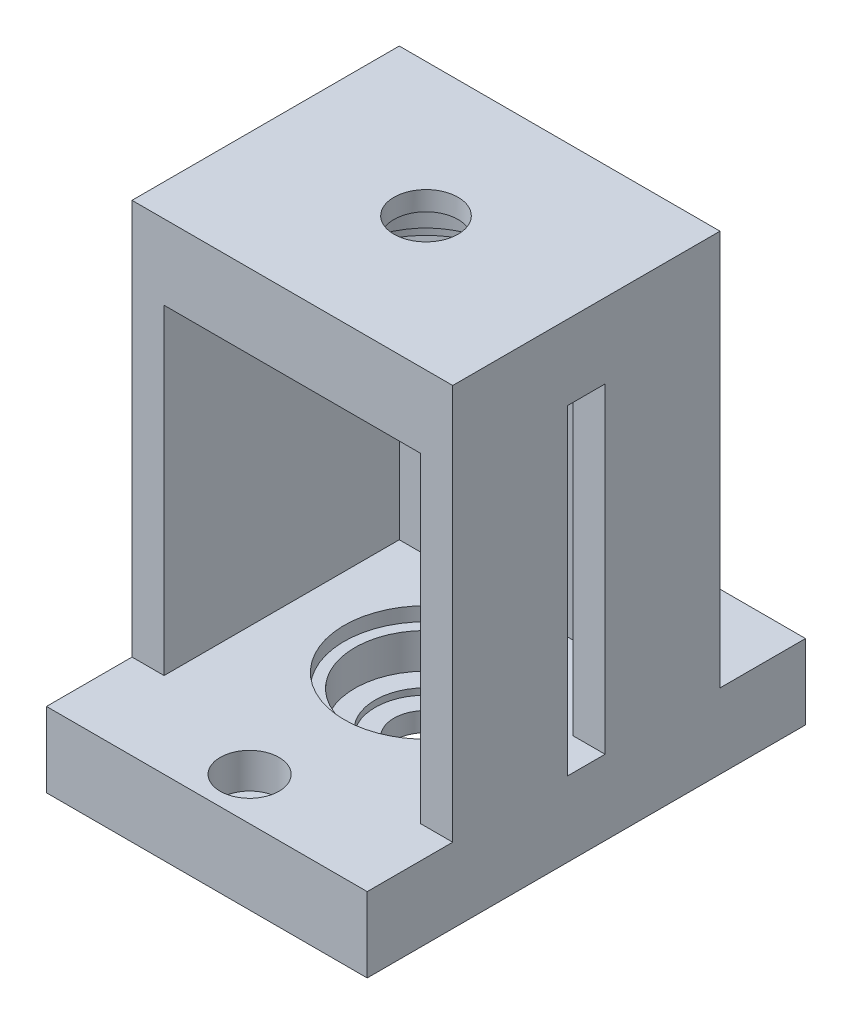
ISO-10303-21;
HEADER;
FILE_DESCRIPTION(('STEP AP214'),'2;1');
FILE_NAME('part.step','',(''),(''),'','','');
FILE_SCHEMA(('AUTOMOTIVE_DESIGN { 1 0 10303 214 1 1 1 1 }'));
ENDSEC;
DATA;
#1=APPLICATION_CONTEXT('core data for automotive mechanical design processes');
#2=APPLICATION_PROTOCOL_DEFINITION('international standard','automotive_design',2000,#1);
#3=PRODUCT_CONTEXT('',#1,'mechanical');
#4=PRODUCT('Part','Part','',(#3));
#5=PRODUCT_RELATED_PRODUCT_CATEGORY('part','',(#4));
#6=PRODUCT_DEFINITION_FORMATION('','',#4);
#7=PRODUCT_DEFINITION_CONTEXT('part definition',#1,'design');
#8=PRODUCT_DEFINITION('design','',#6,#7);
#9=PRODUCT_DEFINITION_SHAPE('','',#8);
#10=(LENGTH_UNIT() NAMED_UNIT(*) SI_UNIT(.MILLI.,.METRE.));
#11=(NAMED_UNIT(*) PLANE_ANGLE_UNIT() SI_UNIT($,.RADIAN.));
#12=(NAMED_UNIT(*) SI_UNIT($,.STERADIAN.) SOLID_ANGLE_UNIT());
#13=UNCERTAINTY_MEASURE_WITH_UNIT(LENGTH_MEASURE(1.E-05),#10,'distance_accuracy_value','');
#14=(GEOMETRIC_REPRESENTATION_CONTEXT(3) GLOBAL_UNCERTAINTY_ASSIGNED_CONTEXT((#13)) GLOBAL_UNIT_ASSIGNED_CONTEXT((#10,
#11,#12)) REPRESENTATION_CONTEXT('',''));
#15=CARTESIAN_POINT('',(0.,0.,0.));
#16=DIRECTION('',(0.,0.,1.));
#17=DIRECTION('',(1.,0.,0.));
#18=AXIS2_PLACEMENT_3D('',#15,#16,#17);
#19=CARTESIAN_POINT('',(0.,7.,16.5));
#20=DIRECTION('',(0.,-1.,0.));
#21=DIRECTION('',(0.,0.,-1.));
#22=AXIS2_PLACEMENT_3D('',#19,#20,#21);
#23=CYLINDRICAL_SURFACE('',#22,1.65);
#24=CARTESIAN_POINT('',(0.,0.,16.5));
#25=DIRECTION('',(0.,1.,0.));
#26=DIRECTION('',(0.,0.,1.));
#27=AXIS2_PLACEMENT_3D('',#24,#25,#26);
#28=CIRCLE('',#27,1.65);
#29=CARTESIAN_POINT('',(0.,0.,18.15));
#30=VERTEX_POINT('',#29);
#31=EDGE_CURVE('E201',#30,#30,#28,.T.);
#32=ORIENTED_EDGE('',*,*,#31,.F.);
#33=EDGE_LOOP('',(#32));
#34=FACE_BOUND('',#33,.T.);
#35=CARTESIAN_POINT('',(0.,3.7,16.5));
#36=DIRECTION('',(0.,1.,0.));
#37=DIRECTION('',(0.,0.,1.));
#38=AXIS2_PLACEMENT_3D('',#35,#36,#37);
#39=CIRCLE('',#38,1.65);
#40=CARTESIAN_POINT('',(0.,3.7,18.15));
#41=VERTEX_POINT('',#40);
#42=EDGE_CURVE('E49',#41,#41,#39,.T.);
#43=ORIENTED_EDGE('',*,*,#42,.T.);
#44=EDGE_LOOP('',(#43));
#45=FACE_BOUND('',#44,.T.);
#46=ADVANCED_FACE('F45',(#34,#45),#23,.F.);
#47=CARTESIAN_POINT('',(0.,7.,-16.5));
#48=DIRECTION('',(0.,-1.,0.));
#49=DIRECTION('',(0.,0.,-1.));
#50=AXIS2_PLACEMENT_3D('',#47,#48,#49);
#51=CYLINDRICAL_SURFACE('',#50,1.65);
#52=CARTESIAN_POINT('',(0.,0.,-16.5));
#53=DIRECTION('',(0.,1.,0.));
#54=DIRECTION('',(0.,0.,-1.));
#55=AXIS2_PLACEMENT_3D('',#52,#53,#54);
#56=CIRCLE('',#55,1.65);
#57=CARTESIAN_POINT('',(0.,0.,-18.15));
#58=VERTEX_POINT('',#57);
#59=EDGE_CURVE('E221',#58,#58,#56,.T.);
#60=ORIENTED_EDGE('',*,*,#59,.F.);
#61=EDGE_LOOP('',(#60));
#62=FACE_BOUND('',#61,.T.);
#63=CARTESIAN_POINT('',(0.,3.7,-16.5));
#64=DIRECTION('',(0.,1.,0.));
#65=DIRECTION('',(0.,0.,1.));
#66=AXIS2_PLACEMENT_3D('',#63,#64,#65);
#67=CIRCLE('',#66,1.65);
#68=CARTESIAN_POINT('',(0.,3.7,-14.85));
#69=VERTEX_POINT('',#68);
#70=EDGE_CURVE('E398',#69,#69,#67,.T.);
#71=ORIENTED_EDGE('',*,*,#70,.T.);
#72=EDGE_LOOP('',(#71));
#73=FACE_BOUND('',#72,.T.);
#74=ADVANCED_FACE('F432',(#62,#73),#51,.F.);
#75=CARTESIAN_POINT('',(-15.,7.,-12.5));
#76=DIRECTION('',(0.,0.,1.));
#77=DIRECTION('',(1.,0.,0.));
#78=AXIS2_PLACEMENT_3D('',#75,#76,#77);
#79=PLANE('',#78);
#80=DIRECTION('',(1.,0.,0.));
#81=VECTOR('',#80,1.);
#82=CARTESIAN_POINT('',(-15.,7.,-12.5));
#83=LINE('',#82,#81);
#84=CARTESIAN_POINT('',(-15.,7.,-12.5));
#85=VERTEX_POINT('',#84);
#86=CARTESIAN_POINT('',(15.,7.,-12.5));
#87=VERTEX_POINT('',#86);
#88=EDGE_CURVE('E64',#85,#87,#83,.T.);
#89=ORIENTED_EDGE('',*,*,#88,.F.);
#90=DIRECTION('',(0.,-1.,0.));
#91=VECTOR('',#90,1.);
#92=CARTESIAN_POINT('',(-15.,7.,-12.5));
#93=LINE('',#92,#91);
#94=CARTESIAN_POINT('',(-15.,44.,-12.5));
#95=VERTEX_POINT('',#94);
#96=EDGE_CURVE('E170',#95,#85,#93,.T.);
#97=ORIENTED_EDGE('',*,*,#96,.F.);
#98=DIRECTION('',(-1.,0.,0.));
#99=VECTOR('',#98,1.);
#100=CARTESIAN_POINT('',(15.,44.,-12.5));
#101=LINE('',#100,#99);
#102=CARTESIAN_POINT('',(15.,44.,-12.5));
#103=VERTEX_POINT('',#102);
#104=EDGE_CURVE('E330',#103,#95,#101,.T.);
#105=ORIENTED_EDGE('',*,*,#104,.F.);
#106=DIRECTION('',(0.,-1.,0.));
#107=VECTOR('',#106,1.);
#108=CARTESIAN_POINT('',(15.,7.,-12.5));
#109=LINE('',#108,#107);
#110=EDGE_CURVE('E55',#103,#87,#109,.T.);
#111=ORIENTED_EDGE('',*,*,#110,.T.);
#112=EDGE_LOOP('',(#89,#97,#105,#111));
#113=FACE_BOUND('',#112,.T.);
#114=ADVANCED_FACE('F495',(#113),#79,.F.);
#115=CARTESIAN_POINT('',(-15.,7.,12.5));
#116=DIRECTION('',(0.,0.,-1.));
#117=DIRECTION('',(-1.,0.,0.));
#118=AXIS2_PLACEMENT_3D('',#115,#116,#117);
#119=PLANE('',#118);
#120=DIRECTION('',(-1.,0.,0.));
#121=VECTOR('',#120,1.);
#122=CARTESIAN_POINT('',(-15.,7.,12.5));
#123=LINE('',#122,#121);
#124=CARTESIAN_POINT('',(15.,7.,12.5));
#125=VERTEX_POINT('',#124);
#126=CARTESIAN_POINT('',(12.,7.,12.5));
#127=VERTEX_POINT('',#126);
#128=EDGE_CURVE('E57',#125,#127,#123,.T.);
#129=ORIENTED_EDGE('',*,*,#128,.F.);
#130=DIRECTION('',(0.,-1.,0.));
#131=VECTOR('',#130,1.);
#132=CARTESIAN_POINT('',(15.,7.,12.5));
#133=LINE('',#132,#131);
#134=CARTESIAN_POINT('',(15.,44.,12.5));
#135=VERTEX_POINT('',#134);
#136=EDGE_CURVE('E171',#135,#125,#133,.T.);
#137=ORIENTED_EDGE('',*,*,#136,.F.);
#138=DIRECTION('',(1.,0.,0.));
#139=VECTOR('',#138,1.);
#140=CARTESIAN_POINT('',(-15.,44.,12.5));
#141=LINE('',#140,#139);
#142=CARTESIAN_POINT('',(-15.,44.,12.5));
#143=VERTEX_POINT('',#142);
#144=EDGE_CURVE('E164',#143,#135,#141,.T.);
#145=ORIENTED_EDGE('',*,*,#144,.F.);
#146=DIRECTION('',(0.,-1.,0.));
#147=VECTOR('',#146,1.);
#148=CARTESIAN_POINT('',(-15.,7.,12.5));
#149=LINE('',#148,#147);
#150=CARTESIAN_POINT('',(-15.,7.,12.5));
#151=VERTEX_POINT('',#150);
#152=EDGE_CURVE('E160',#143,#151,#149,.T.);
#153=ORIENTED_EDGE('',*,*,#152,.T.);
#154=CARTESIAN_POINT('',(-12.,7.,12.5));
#155=VERTEX_POINT('',#154);
#156=EDGE_CURVE('E11',#155,#151,#123,.T.);
#157=ORIENTED_EDGE('',*,*,#156,.F.);
#158=DIRECTION('',(0.,-1.,0.));
#159=VECTOR('',#158,1.);
#160=CARTESIAN_POINT('',(-12.,37.,12.5));
#161=LINE('',#160,#159);
#162=CARTESIAN_POINT('',(-12.,37.,12.5));
#163=VERTEX_POINT('',#162);
#164=EDGE_CURVE('E381',#163,#155,#161,.T.);
#165=ORIENTED_EDGE('',*,*,#164,.F.);
#166=DIRECTION('',(1.,0.,0.));
#167=VECTOR('',#166,1.);
#168=CARTESIAN_POINT('',(-15.,37.,12.5));
#169=LINE('',#168,#167);
#170=CARTESIAN_POINT('',(12.,37.,12.5));
#171=VERTEX_POINT('',#170);
#172=EDGE_CURVE('E326',#163,#171,#169,.T.);
#173=ORIENTED_EDGE('',*,*,#172,.T.);
#174=DIRECTION('',(0.,-1.,0.));
#175=VECTOR('',#174,1.);
#176=CARTESIAN_POINT('',(12.,37.,12.5));
#177=LINE('',#176,#175);
#178=EDGE_CURVE('E360',#171,#127,#177,.T.);
#179=ORIENTED_EDGE('',*,*,#178,.T.);
#180=EDGE_LOOP('',(#129,#137,#145,#153,#157,#165,#173,#179));
#181=FACE_BOUND('',#180,.T.);
#182=ADVANCED_FACE('F161',(#181),#119,.F.);
#183=CARTESIAN_POINT('',(15.,7.,12.5));
#184=DIRECTION('',(-1.,0.,0.));
#185=DIRECTION('',(0.,0.,1.));
#186=AXIS2_PLACEMENT_3D('',#183,#184,#185);
#187=PLANE('',#186);
#188=DIRECTION('',(0.,0.,-1.));
#189=VECTOR('',#188,1.);
#190=CARTESIAN_POINT('',(15.,0.,12.5));
#191=LINE('',#190,#189);
#192=CARTESIAN_POINT('',(15.,0.,20.5));
#193=VERTEX_POINT('',#192);
#194=CARTESIAN_POINT('',(15.,0.,-20.5));
#195=VERTEX_POINT('',#194);
#196=EDGE_CURVE('E384',#193,#195,#191,.T.);
#197=ORIENTED_EDGE('',*,*,#196,.T.);
#198=DIRECTION('',(0.,-1.,0.));
#199=VECTOR('',#198,1.);
#200=CARTESIAN_POINT('',(15.,7.,-20.5));
#201=LINE('',#200,#199);
#202=CARTESIAN_POINT('',(15.,7.,-20.5));
#203=VERTEX_POINT('',#202);
#204=EDGE_CURVE('E208',#203,#195,#201,.T.);
#205=ORIENTED_EDGE('',*,*,#204,.F.);
#206=DIRECTION('',(0.,0.,-1.));
#207=VECTOR('',#206,1.);
#208=CARTESIAN_POINT('',(15.,7.,-20.5));
#209=LINE('',#208,#207);
#210=EDGE_CURVE('E228',#87,#203,#209,.T.);
#211=ORIENTED_EDGE('',*,*,#210,.F.);
#212=ORIENTED_EDGE('',*,*,#110,.F.);
#213=DIRECTION('',(0.,0.,-1.));
#214=VECTOR('',#213,1.);
#215=CARTESIAN_POINT('',(15.,44.,12.5));
#216=LINE('',#215,#214);
#217=EDGE_CURVE('E339',#135,#103,#216,.T.);
#218=ORIENTED_EDGE('',*,*,#217,.F.);
#219=ORIENTED_EDGE('',*,*,#136,.T.);
#220=DIRECTION('',(0.,0.,-1.));
#221=VECTOR('',#220,1.);
#222=CARTESIAN_POINT('',(15.,7.,20.5));
#223=LINE('',#222,#221);
#224=CARTESIAN_POINT('',(15.,7.,20.5));
#225=VERTEX_POINT('',#224);
#226=EDGE_CURVE('E189',#225,#125,#223,.T.);
#227=ORIENTED_EDGE('',*,*,#226,.F.);
#228=DIRECTION('',(0.,-1.,0.));
#229=VECTOR('',#228,1.);
#230=CARTESIAN_POINT('',(15.,7.,20.5));
#231=LINE('',#230,#229);
#232=EDGE_CURVE('E197',#225,#193,#231,.T.);
#233=ORIENTED_EDGE('',*,*,#232,.T.);
#234=EDGE_LOOP('',(#197,#205,#211,#212,#218,#219,#227,#233));
#235=FACE_BOUND('',#234,.T.);
#236=DIRECTION('',(0.,1.,0.));
#237=VECTOR('',#236,1.);
#238=CARTESIAN_POINT('',(15.,7.,-1.75));
#239=LINE('',#238,#237);
#240=CARTESIAN_POINT('',(15.,7.,-1.75));
#241=VERTEX_POINT('',#240);
#242=CARTESIAN_POINT('',(15.,37.,-1.75));
#243=VERTEX_POINT('',#242);
#244=EDGE_CURVE('E265',#241,#243,#239,.T.);
#245=ORIENTED_EDGE('',*,*,#244,.F.);
#246=DIRECTION('',(0.,0.,-1.));
#247=VECTOR('',#246,1.);
#248=CARTESIAN_POINT('',(15.,7.,12.5));
#249=LINE('',#248,#247);
#250=CARTESIAN_POINT('',(15.,7.,1.75));
#251=VERTEX_POINT('',#250);
#252=EDGE_CURVE('E251',#251,#241,#249,.T.);
#253=ORIENTED_EDGE('',*,*,#252,.F.);
#254=DIRECTION('',(0.,-1.,0.));
#255=VECTOR('',#254,1.);
#256=CARTESIAN_POINT('',(15.,7.,1.75));
#257=LINE('',#256,#255);
#258=CARTESIAN_POINT('',(15.,37.,1.75));
#259=VERTEX_POINT('',#258);
#260=EDGE_CURVE('E257',#259,#251,#257,.T.);
#261=ORIENTED_EDGE('',*,*,#260,.F.);
#262=DIRECTION('',(0.,0.,1.));
#263=VECTOR('',#262,1.);
#264=CARTESIAN_POINT('',(15.,37.,12.5));
#265=LINE('',#264,#263);
#266=EDGE_CURVE('E248',#243,#259,#265,.T.);
#267=ORIENTED_EDGE('',*,*,#266,.F.);
#268=EDGE_LOOP('',(#245,#253,#261,#267));
#269=FACE_BOUND('',#268,.T.);
#270=ADVANCED_FACE('F47',(#235,#269),#187,.F.);
#271=CARTESIAN_POINT('',(12.,37.,-9.49999999999999));
#272=DIRECTION('',(1.,0.,0.));
#273=DIRECTION('',(0.,0.,-1.));
#274=AXIS2_PLACEMENT_3D('',#271,#272,#273);
#275=PLANE('',#274);
#276=DIRECTION('',(0.,-1.,0.));
#277=VECTOR('',#276,1.);
#278=CARTESIAN_POINT('',(12.,37.,-1.75));
#279=LINE('',#278,#277);
#280=CARTESIAN_POINT('',(12.,37.,-1.75));
#281=VERTEX_POINT('',#280);
#282=CARTESIAN_POINT('',(12.,7.,-1.75));
#283=VERTEX_POINT('',#282);
#284=EDGE_CURVE('E261',#281,#283,#279,.T.);
#285=ORIENTED_EDGE('',*,*,#284,.F.);
#286=DIRECTION('',(0.,0.,1.));
#287=VECTOR('',#286,1.);
#288=CARTESIAN_POINT('',(12.,37.,-9.49999999999999));
#289=LINE('',#288,#287);
#290=CARTESIAN_POINT('',(12.,37.,-9.49999999999999));
#291=VERTEX_POINT('',#290);
#292=EDGE_CURVE('E356',#291,#281,#289,.T.);
#293=ORIENTED_EDGE('',*,*,#292,.F.);
#294=DIRECTION('',(0.,-1.,0.));
#295=VECTOR('',#294,1.);
#296=CARTESIAN_POINT('',(12.,37.,-9.49999999999999));
#297=LINE('',#296,#295);
#298=CARTESIAN_POINT('',(12.,7.,-9.49999999999999));
#299=VERTEX_POINT('',#298);
#300=EDGE_CURVE('E373',#291,#299,#297,.T.);
#301=ORIENTED_EDGE('',*,*,#300,.T.);
#302=DIRECTION('',(0.,0.,1.));
#303=VECTOR('',#302,1.);
#304=CARTESIAN_POINT('',(12.,7.,-9.49999999999999));
#305=LINE('',#304,#303);
#306=EDGE_CURVE('E351',#299,#283,#305,.T.);
#307=ORIENTED_EDGE('',*,*,#306,.T.);
#308=EDGE_LOOP('',(#285,#293,#301,#307));
#309=FACE_BOUND('',#308,.T.);
#310=ADVANCED_FACE('F479',(#309),#275,.F.);
#311=DIRECTION('',(0.,1.,0.));
#312=VECTOR('',#311,1.);
#313=CARTESIAN_POINT('',(12.,37.,1.75));
#314=LINE('',#313,#312);
#315=CARTESIAN_POINT('',(12.,7.,1.75));
#316=VERTEX_POINT('',#315);
#317=CARTESIAN_POINT('',(12.,37.,1.75));
#318=VERTEX_POINT('',#317);
#319=EDGE_CURVE('E254',#316,#318,#314,.T.);
#320=ORIENTED_EDGE('',*,*,#319,.F.);
#321=EDGE_CURVE('E367',#316,#127,#305,.T.);
#322=ORIENTED_EDGE('',*,*,#321,.T.);
#323=ORIENTED_EDGE('',*,*,#178,.F.);
#324=EDGE_CURVE('E355',#318,#171,#289,.T.);
#325=ORIENTED_EDGE('',*,*,#324,.F.);
#326=EDGE_LOOP('',(#320,#322,#323,#325));
#327=FACE_BOUND('',#326,.T.);
#328=ADVANCED_FACE('F451',(#327),#275,.F.);
#329=CARTESIAN_POINT('',(0.,7.,0.));
#330=DIRECTION('',(0.,-1.,0.));
#331=DIRECTION('',(0.,0.,-1.));
#332=AXIS2_PLACEMENT_3D('',#329,#330,#331);
#333=PLANE('',#332);
#334=CARTESIAN_POINT('',(0.,7.,16.5));
#335=DIRECTION('',(0.,1.,0.));
#336=DIRECTION('',(0.,0.,1.));
#337=AXIS2_PLACEMENT_3D('',#334,#335,#336);
#338=CIRCLE('',#337,2.75);
#339=CARTESIAN_POINT('',(0.,7.,19.25));
#340=VERTEX_POINT('',#339);
#341=EDGE_CURVE('E414',#340,#340,#338,.T.);
#342=ORIENTED_EDGE('',*,*,#341,.F.);
#343=EDGE_LOOP('',(#342));
#344=FACE_BOUND('',#343,.T.);
#345=CARTESIAN_POINT('',(0.,7.,0.));
#346=DIRECTION('',(0.,1.,0.));
#347=DIRECTION('',(0.,0.,1.));
#348=AXIS2_PLACEMENT_3D('',#345,#346,#347);
#349=CIRCLE('',#348,7.65);
#350=CARTESIAN_POINT('',(0.,7.,7.65));
#351=VERTEX_POINT('',#350);
#352=EDGE_CURVE('E318',#351,#351,#349,.T.);
#353=ORIENTED_EDGE('',*,*,#352,.F.);
#354=EDGE_LOOP('',(#353));
#355=FACE_BOUND('',#354,.T.);
#356=DIRECTION('',(-1.,0.,0.));
#357=VECTOR('',#356,1.);
#358=CARTESIAN_POINT('',(15.000012,7.,-1.75));
#359=LINE('',#358,#357);
#360=EDGE_CURVE('E207',#241,#283,#359,.T.);
#361=ORIENTED_EDGE('',*,*,#360,.T.);
#362=ORIENTED_EDGE('',*,*,#306,.F.);
#363=DIRECTION('',(1.,0.,0.));
#364=VECTOR('',#363,1.);
#365=CARTESIAN_POINT('',(-12.,7.,-9.49999999999999));
#366=LINE('',#365,#364);
#367=CARTESIAN_POINT('',(-12.,7.,-9.49999999999999));
#368=VERTEX_POINT('',#367);
#369=EDGE_CURVE('E363',#368,#299,#366,.T.);
#370=ORIENTED_EDGE('',*,*,#369,.F.);
#371=DIRECTION('',(0.,0.,-1.));
#372=VECTOR('',#371,1.);
#373=CARTESIAN_POINT('',(-12.,7.,12.5));
#374=LINE('',#373,#372);
#375=EDGE_CURVE('E178',#155,#368,#374,.T.);
#376=ORIENTED_EDGE('',*,*,#375,.F.);
#377=ORIENTED_EDGE('',*,*,#156,.T.);
#378=DIRECTION('',(0.,0.,1.));
#379=VECTOR('',#378,1.);
#380=CARTESIAN_POINT('',(-15.,7.,12.5));
#381=LINE('',#380,#379);
#382=CARTESIAN_POINT('',(-15.,7.,20.5));
#383=VERTEX_POINT('',#382);
#384=EDGE_CURVE('E175',#151,#383,#381,.T.);
#385=ORIENTED_EDGE('',*,*,#384,.T.);
#386=DIRECTION('',(1.,0.,0.));
#387=VECTOR('',#386,1.);
#388=CARTESIAN_POINT('',(-15.,7.,20.5));
#389=LINE('',#388,#387);
#390=EDGE_CURVE('E185',#383,#225,#389,.T.);
#391=ORIENTED_EDGE('',*,*,#390,.T.);
#392=ORIENTED_EDGE('',*,*,#226,.T.);
#393=ORIENTED_EDGE('',*,*,#128,.T.);
#394=ORIENTED_EDGE('',*,*,#321,.F.);
#395=DIRECTION('',(-1.,0.,0.));
#396=VECTOR('',#395,1.);
#397=CARTESIAN_POINT('',(15.000012,7.,1.75));
#398=LINE('',#397,#396);
#399=EDGE_CURVE('E238',#251,#316,#398,.T.);
#400=ORIENTED_EDGE('',*,*,#399,.F.);
#401=ORIENTED_EDGE('',*,*,#252,.T.);
#402=EDGE_LOOP('',(#361,#362,#370,#376,#377,#385,#391,#392,#393,#394,#400,#401));
#403=FACE_BOUND('',#402,.T.);
#404=ADVANCED_FACE('F174',(#344,#355,#403),#333,.F.);
#405=CARTESIAN_POINT('',(-15.,7.,12.5));
#406=DIRECTION('',(1.,0.,0.));
#407=DIRECTION('',(0.,0.,-1.));
#408=AXIS2_PLACEMENT_3D('',#405,#406,#407);
#409=PLANE('',#408);
#410=DIRECTION('',(0.,0.,1.));
#411=VECTOR('',#410,1.);
#412=CARTESIAN_POINT('',(-15.,0.,12.5));
#413=LINE('',#412,#411);
#414=CARTESIAN_POINT('',(-15.,0.,-20.5));
#415=VERTEX_POINT('',#414);
#416=CARTESIAN_POINT('',(-15.,0.,20.5));
#417=VERTEX_POINT('',#416);
#418=EDGE_CURVE('E387',#415,#417,#413,.T.);
#419=ORIENTED_EDGE('',*,*,#418,.T.);
#420=DIRECTION('',(0.,-1.,0.));
#421=VECTOR('',#420,1.);
#422=CARTESIAN_POINT('',(-15.,7.,20.5));
#423=LINE('',#422,#421);
#424=EDGE_CURVE('E182',#383,#417,#423,.T.);
#425=ORIENTED_EDGE('',*,*,#424,.F.);
#426=ORIENTED_EDGE('',*,*,#384,.F.);
#427=ORIENTED_EDGE('',*,*,#152,.F.);
#428=DIRECTION('',(0.,0.,1.));
#429=VECTOR('',#428,1.);
#430=CARTESIAN_POINT('',(-15.,44.,-12.5));
#431=LINE('',#430,#429);
#432=EDGE_CURVE('E334',#95,#143,#431,.T.);
#433=ORIENTED_EDGE('',*,*,#432,.F.);
#434=ORIENTED_EDGE('',*,*,#96,.T.);
#435=DIRECTION('',(0.,0.,1.));
#436=VECTOR('',#435,1.);
#437=CARTESIAN_POINT('',(-15.,7.,-12.5));
#438=LINE('',#437,#436);
#439=CARTESIAN_POINT('',(-15.,7.,-20.5));
#440=VERTEX_POINT('',#439);
#441=EDGE_CURVE('E216',#440,#85,#438,.T.);
#442=ORIENTED_EDGE('',*,*,#441,.F.);
#443=DIRECTION('',(0.,-1.,0.));
#444=VECTOR('',#443,1.);
#445=CARTESIAN_POINT('',(-15.,7.,-20.5));
#446=LINE('',#445,#444);
#447=EDGE_CURVE('E212',#440,#415,#446,.T.);
#448=ORIENTED_EDGE('',*,*,#447,.T.);
#449=EDGE_LOOP('',(#419,#425,#426,#427,#433,#434,#442,#448));
#450=FACE_BOUND('',#449,.T.);
#451=ADVANCED_FACE('F180',(#450),#409,.F.);
#452=CARTESIAN_POINT('',(0.,0.,0.));
#453=DIRECTION('',(0.,-1.,0.));
#454=DIRECTION('',(0.,0.,-1.));
#455=AXIS2_PLACEMENT_3D('',#452,#453,#454);
#456=PLANE('',#455);
#457=CARTESIAN_POINT('',(0.,0.,0.));
#458=DIRECTION('',(0.,1.,0.));
#459=DIRECTION('',(0.,0.,1.));
#460=AXIS2_PLACEMENT_3D('',#457,#458,#459);
#461=CIRCLE('',#460,3.);
#462=CARTESIAN_POINT('',(0.,0.,3.));
#463=VERTEX_POINT('',#462);
#464=EDGE_CURVE('E272',#463,#463,#461,.T.);
#465=ORIENTED_EDGE('',*,*,#464,.T.);
#466=EDGE_LOOP('',(#465));
#467=FACE_BOUND('',#466,.T.);
#468=ORIENTED_EDGE('',*,*,#196,.F.);
#469=DIRECTION('',(1.,0.,0.));
#470=VECTOR('',#469,1.);
#471=CARTESIAN_POINT('',(-15.,0.,20.5));
#472=LINE('',#471,#470);
#473=EDGE_CURVE('E191',#417,#193,#472,.T.);
#474=ORIENTED_EDGE('',*,*,#473,.F.);
#475=ORIENTED_EDGE('',*,*,#418,.F.);
#476=DIRECTION('',(-1.,0.,0.));
#477=VECTOR('',#476,1.);
#478=CARTESIAN_POINT('',(-15.,0.,-20.5));
#479=LINE('',#478,#477);
#480=EDGE_CURVE('E217',#195,#415,#479,.T.);
#481=ORIENTED_EDGE('',*,*,#480,.F.);
#482=EDGE_LOOP('',(#468,#474,#475,#481));
#483=FACE_BOUND('',#482,.T.);
#484=ORIENTED_EDGE('',*,*,#31,.T.);
#485=EDGE_LOOP('',(#484));
#486=FACE_BOUND('',#485,.T.);
#487=ORIENTED_EDGE('',*,*,#59,.T.);
#488=EDGE_LOOP('',(#487));
#489=FACE_BOUND('',#488,.T.);
#490=ADVANCED_FACE('F427',(#467,#483,#486,#489),#456,.T.);
#491=CARTESIAN_POINT('',(-12.,37.,12.5));
#492=DIRECTION('',(-1.,0.,0.));
#493=DIRECTION('',(0.,0.,1.));
#494=AXIS2_PLACEMENT_3D('',#491,#492,#493);
#495=PLANE('',#494);
#496=ORIENTED_EDGE('',*,*,#375,.T.);
#497=DIRECTION('',(0.,-1.,0.));
#498=VECTOR('',#497,1.);
#499=CARTESIAN_POINT('',(-12.,37.,-9.49999999999999));
#500=LINE('',#499,#498);
#501=CARTESIAN_POINT('',(-12.,37.,-9.49999999999999));
#502=VERTEX_POINT('',#501);
#503=EDGE_CURVE('E377',#502,#368,#500,.T.);
#504=ORIENTED_EDGE('',*,*,#503,.F.);
#505=DIRECTION('',(0.,0.,-1.));
#506=VECTOR('',#505,1.);
#507=CARTESIAN_POINT('',(-12.,37.,12.5));
#508=LINE('',#507,#506);
#509=EDGE_CURVE('E346',#163,#502,#508,.T.);
#510=ORIENTED_EDGE('',*,*,#509,.F.);
#511=ORIENTED_EDGE('',*,*,#164,.T.);
#512=EDGE_LOOP('',(#496,#504,#510,#511));
#513=FACE_BOUND('',#512,.T.);
#514=ADVANCED_FACE('F485',(#513),#495,.F.);
#515=CARTESIAN_POINT('',(-12.,37.,-9.49999999999999));
#516=DIRECTION('',(0.,0.,-1.));
#517=DIRECTION('',(-1.,0.,0.));
#518=AXIS2_PLACEMENT_3D('',#515,#516,#517);
#519=PLANE('',#518);
#520=ORIENTED_EDGE('',*,*,#369,.T.);
#521=ORIENTED_EDGE('',*,*,#300,.F.);
#522=DIRECTION('',(1.,0.,0.));
#523=VECTOR('',#522,1.);
#524=CARTESIAN_POINT('',(-12.,37.,-9.49999999999999));
#525=LINE('',#524,#523);
#526=EDGE_CURVE('E350',#502,#291,#525,.T.);
#527=ORIENTED_EDGE('',*,*,#526,.F.);
#528=ORIENTED_EDGE('',*,*,#503,.T.);
#529=EDGE_LOOP('',(#520,#521,#527,#528));
#530=FACE_BOUND('',#529,.T.);
#531=ADVANCED_FACE('F477',(#530),#519,.F.);
#532=CARTESIAN_POINT('',(0.,37.,0.));
#533=DIRECTION('',(0.,1.,0.));
#534=DIRECTION('',(0.,0.,1.));
#535=AXIS2_PLACEMENT_3D('',#532,#533,#534);
#536=PLANE('',#535);
#537=ORIENTED_EDGE('',*,*,#292,.T.);
#538=DIRECTION('',(-1.,0.,0.));
#539=VECTOR('',#538,1.);
#540=CARTESIAN_POINT('',(15.000012,37.,-1.75));
#541=LINE('',#540,#539);
#542=EDGE_CURVE('E245',#243,#281,#541,.T.);
#543=ORIENTED_EDGE('',*,*,#542,.F.);
#544=ORIENTED_EDGE('',*,*,#266,.T.);
#545=DIRECTION('',(-1.,0.,0.));
#546=VECTOR('',#545,1.);
#547=CARTESIAN_POINT('',(15.000012,37.,1.75));
#548=LINE('',#547,#546);
#549=EDGE_CURVE('E241',#259,#318,#548,.T.);
#550=ORIENTED_EDGE('',*,*,#549,.T.);
#551=ORIENTED_EDGE('',*,*,#324,.T.);
#552=ORIENTED_EDGE('',*,*,#172,.F.);
#553=ORIENTED_EDGE('',*,*,#509,.T.);
#554=ORIENTED_EDGE('',*,*,#526,.T.);
#555=EDGE_LOOP('',(#537,#543,#544,#550,#551,#552,#553,#554));
#556=FACE_BOUND('',#555,.T.);
#557=CARTESIAN_POINT('',(0.,37.,0.));
#558=DIRECTION('',(0.,-1.,0.));
#559=DIRECTION('',(0.,0.,-1.));
#560=AXIS2_PLACEMENT_3D('',#557,#558,#559);
#561=CIRCLE('',#560,7.65);
#562=CARTESIAN_POINT('',(0.,37.,-7.65));
#563=VERTEX_POINT('',#562);
#564=EDGE_CURVE('E310',#563,#563,#561,.T.);
#565=ORIENTED_EDGE('',*,*,#564,.F.);
#566=EDGE_LOOP('',(#565));
#567=FACE_BOUND('',#566,.T.);
#568=ADVANCED_FACE('F470',(#556,#567),#536,.F.);
#569=CARTESIAN_POINT('',(0.,44.,0.));
#570=DIRECTION('',(0.,1.,0.));
#571=DIRECTION('',(0.,0.,1.));
#572=AXIS2_PLACEMENT_3D('',#569,#570,#571);
#573=PLANE('',#572);
#574=CARTESIAN_POINT('',(0.,44.,0.));
#575=DIRECTION('',(0.,1.,0.));
#576=DIRECTION('',(0.,0.,1.));
#577=AXIS2_PLACEMENT_3D('',#574,#575,#576);
#578=CIRCLE('',#577,3.);
#579=CARTESIAN_POINT('',(0.,44.,3.));
#580=VERTEX_POINT('',#579);
#581=EDGE_CURVE('E268',#580,#580,#578,.T.);
#582=ORIENTED_EDGE('',*,*,#581,.F.);
#583=EDGE_LOOP('',(#582));
#584=FACE_BOUND('',#583,.T.);
#585=ORIENTED_EDGE('',*,*,#104,.T.);
#586=ORIENTED_EDGE('',*,*,#432,.T.);
#587=ORIENTED_EDGE('',*,*,#144,.T.);
#588=ORIENTED_EDGE('',*,*,#217,.T.);
#589=EDGE_LOOP('',(#585,#586,#587,#588));
#590=FACE_BOUND('',#589,.T.);
#591=ADVANCED_FACE('F458',(#584,#590),#573,.T.);
#592=CARTESIAN_POINT('',(0.,5.7,0.));
#593=DIRECTION('',(0.,1.,0.));
#594=DIRECTION('',(0.,0.,1.));
#595=AXIS2_PLACEMENT_3D('',#592,#593,#594);
#596=CYLINDRICAL_SURFACE('',#595,7.65);
#597=CARTESIAN_POINT('',(0.,5.7,0.));
#598=DIRECTION('',(0.,1.,0.));
#599=DIRECTION('',(0.,0.,1.));
#600=AXIS2_PLACEMENT_3D('',#597,#598,#599);
#601=CIRCLE('',#600,7.65);
#602=CARTESIAN_POINT('',(0.,5.7,7.65));
#603=VERTEX_POINT('',#602);
#604=EDGE_CURVE('E322',#603,#603,#601,.T.);
#605=ORIENTED_EDGE('',*,*,#604,.F.);
#606=EDGE_LOOP('',(#605));
#607=FACE_BOUND('',#606,.T.);
#608=ORIENTED_EDGE('',*,*,#352,.T.);
#609=EDGE_LOOP('',(#608));
#610=FACE_BOUND('',#609,.T.);
#611=ADVANCED_FACE('F455',(#607,#610),#596,.F.);
#612=CARTESIAN_POINT('',(0.,5.7,0.));
#613=DIRECTION('',(0.,1.,0.));
#614=DIRECTION('',(0.,0.,1.));
#615=AXIS2_PLACEMENT_3D('',#612,#613,#614);
#616=PLANE('',#615);
#617=CARTESIAN_POINT('',(0.,5.7,0.));
#618=DIRECTION('',(0.,1.,0.));
#619=DIRECTION('',(0.,0.,1.));
#620=AXIS2_PLACEMENT_3D('',#617,#618,#619);
#621=CIRCLE('',#620,6.65);
#622=CARTESIAN_POINT('',(0.,5.7,6.65));
#623=VERTEX_POINT('',#622);
#624=EDGE_CURVE('E302',#623,#623,#621,.T.);
#625=ORIENTED_EDGE('',*,*,#624,.F.);
#626=EDGE_LOOP('',(#625));
#627=FACE_BOUND('',#626,.T.);
#628=ORIENTED_EDGE('',*,*,#604,.T.);
#629=EDGE_LOOP('',(#628));
#630=FACE_BOUND('',#629,.T.);
#631=ADVANCED_FACE('F457',(#627,#630),#616,.T.);
#632=CARTESIAN_POINT('',(0.,38.3,0.));
#633=DIRECTION('',(0.,-1.,0.));
#634=DIRECTION('',(0.,0.,-1.));
#635=AXIS2_PLACEMENT_3D('',#632,#633,#634);
#636=CYLINDRICAL_SURFACE('',#635,7.65);
#637=CARTESIAN_POINT('',(0.,38.3,0.));
#638=DIRECTION('',(0.,-1.,0.));
#639=DIRECTION('',(0.,0.,-1.));
#640=AXIS2_PLACEMENT_3D('',#637,#638,#639);
#641=CIRCLE('',#640,7.65);
#642=CARTESIAN_POINT('',(0.,38.3,-7.65));
#643=VERTEX_POINT('',#642);
#644=EDGE_CURVE('E314',#643,#643,#641,.T.);
#645=ORIENTED_EDGE('',*,*,#644,.F.);
#646=EDGE_LOOP('',(#645));
#647=FACE_BOUND('',#646,.T.);
#648=ORIENTED_EDGE('',*,*,#564,.T.);
#649=EDGE_LOOP('',(#648));
#650=FACE_BOUND('',#649,.T.);
#651=ADVANCED_FACE('F466',(#647,#650),#636,.F.);
#652=CARTESIAN_POINT('',(0.,38.3,0.));
#653=DIRECTION('',(0.,-1.,0.));
#654=DIRECTION('',(0.,0.,-1.));
#655=AXIS2_PLACEMENT_3D('',#652,#653,#654);
#656=PLANE('',#655);
#657=CARTESIAN_POINT('',(0.,38.3,0.));
#658=DIRECTION('',(0.,-1.,0.));
#659=DIRECTION('',(0.,0.,-1.));
#660=AXIS2_PLACEMENT_3D('',#657,#658,#659);
#661=CIRCLE('',#660,6.65);
#662=CARTESIAN_POINT('',(0.,38.3,-6.65));
#663=VERTEX_POINT('',#662);
#664=EDGE_CURVE('E294',#663,#663,#661,.T.);
#665=ORIENTED_EDGE('',*,*,#664,.F.);
#666=EDGE_LOOP('',(#665));
#667=FACE_BOUND('',#666,.T.);
#668=ORIENTED_EDGE('',*,*,#644,.T.);
#669=EDGE_LOOP('',(#668));
#670=FACE_BOUND('',#669,.T.);
#671=ADVANCED_FACE('F555',(#667,#670),#656,.T.);
#672=CARTESIAN_POINT('',(0.,2.4,0.));
#673=DIRECTION('',(0.,1.,0.));
#674=DIRECTION('',(0.,0.,1.));
#675=AXIS2_PLACEMENT_3D('',#672,#673,#674);
#676=CYLINDRICAL_SURFACE('',#675,6.65);
#677=CARTESIAN_POINT('',(0.,2.4,0.));
#678=DIRECTION('',(0.,1.,0.));
#679=DIRECTION('',(0.,0.,1.));
#680=AXIS2_PLACEMENT_3D('',#677,#678,#679);
#681=CIRCLE('',#680,6.65);
#682=CARTESIAN_POINT('',(0.,2.4,6.65));
#683=VERTEX_POINT('',#682);
#684=EDGE_CURVE('E306',#683,#683,#681,.T.);
#685=ORIENTED_EDGE('',*,*,#684,.F.);
#686=EDGE_LOOP('',(#685));
#687=FACE_BOUND('',#686,.T.);
#688=ORIENTED_EDGE('',*,*,#624,.T.);
#689=EDGE_LOOP('',(#688));
#690=FACE_BOUND('',#689,.T.);
#691=ADVANCED_FACE('F551',(#687,#690),#676,.F.);
#692=CARTESIAN_POINT('',(0.,2.4,0.));
#693=DIRECTION('',(0.,1.,0.));
#694=DIRECTION('',(0.,0.,1.));
#695=AXIS2_PLACEMENT_3D('',#692,#693,#694);
#696=PLANE('',#695);
#697=CARTESIAN_POINT('',(0.,2.4,0.));
#698=DIRECTION('',(0.,1.,0.));
#699=DIRECTION('',(0.,0.,1.));
#700=AXIS2_PLACEMENT_3D('',#697,#698,#699);
#701=CIRCLE('',#700,4.75);
#702=CARTESIAN_POINT('',(0.,2.4,4.75));
#703=VERTEX_POINT('',#702);
#704=EDGE_CURVE('E286',#703,#703,#701,.T.);
#705=ORIENTED_EDGE('',*,*,#704,.F.);
#706=EDGE_LOOP('',(#705));
#707=FACE_BOUND('',#706,.T.);
#708=ORIENTED_EDGE('',*,*,#684,.T.);
#709=EDGE_LOOP('',(#708));
#710=FACE_BOUND('',#709,.T.);
#711=ADVANCED_FACE('F547',(#707,#710),#696,.T.);
#712=CARTESIAN_POINT('',(0.,41.6,0.));
#713=DIRECTION('',(0.,-1.,0.));
#714=DIRECTION('',(0.,0.,-1.));
#715=AXIS2_PLACEMENT_3D('',#712,#713,#714);
#716=CYLINDRICAL_SURFACE('',#715,6.65);
#717=CARTESIAN_POINT('',(0.,41.6,0.));
#718=DIRECTION('',(0.,-1.,0.));
#719=DIRECTION('',(0.,0.,-1.));
#720=AXIS2_PLACEMENT_3D('',#717,#718,#719);
#721=CIRCLE('',#720,6.65);
#722=CARTESIAN_POINT('',(0.,41.6,-6.65));
#723=VERTEX_POINT('',#722);
#724=EDGE_CURVE('E298',#723,#723,#721,.T.);
#725=ORIENTED_EDGE('',*,*,#724,.F.);
#726=EDGE_LOOP('',(#725));
#727=FACE_BOUND('',#726,.T.);
#728=ORIENTED_EDGE('',*,*,#664,.T.);
#729=EDGE_LOOP('',(#728));
#730=FACE_BOUND('',#729,.T.);
#731=ADVANCED_FACE('F543',(#727,#730),#716,.F.);
#732=CARTESIAN_POINT('',(0.,41.6,0.));
#733=DIRECTION('',(0.,-1.,0.));
#734=DIRECTION('',(0.,0.,-1.));
#735=AXIS2_PLACEMENT_3D('',#732,#733,#734);
#736=PLANE('',#735);
#737=CARTESIAN_POINT('',(0.,41.6,0.));
#738=DIRECTION('',(0.,-1.,0.));
#739=DIRECTION('',(0.,0.,-1.));
#740=AXIS2_PLACEMENT_3D('',#737,#738,#739);
#741=CIRCLE('',#740,4.75);
#742=CARTESIAN_POINT('',(0.,41.6,-4.75));
#743=VERTEX_POINT('',#742);
#744=EDGE_CURVE('E281',#743,#743,#741,.T.);
#745=ORIENTED_EDGE('',*,*,#744,.F.);
#746=EDGE_LOOP('',(#745));
#747=FACE_BOUND('',#746,.T.);
#748=ORIENTED_EDGE('',*,*,#724,.T.);
#749=EDGE_LOOP('',(#748));
#750=FACE_BOUND('',#749,.T.);
#751=ADVANCED_FACE('F539',(#747,#750),#736,.T.);
#752=CARTESIAN_POINT('',(0.,1.8,0.));
#753=DIRECTION('',(0.,1.,0.));
#754=DIRECTION('',(0.,0.,1.));
#755=AXIS2_PLACEMENT_3D('',#752,#753,#754);
#756=CYLINDRICAL_SURFACE('',#755,4.75);
#757=CARTESIAN_POINT('',(0.,1.8,0.));
#758=DIRECTION('',(0.,1.,0.));
#759=DIRECTION('',(0.,0.,1.));
#760=AXIS2_PLACEMENT_3D('',#757,#758,#759);
#761=CIRCLE('',#760,4.75);
#762=CARTESIAN_POINT('',(0.,1.8,4.75));
#763=VERTEX_POINT('',#762);
#764=EDGE_CURVE('E290',#763,#763,#761,.T.);
#765=ORIENTED_EDGE('',*,*,#764,.F.);
#766=EDGE_LOOP('',(#765));
#767=FACE_BOUND('',#766,.T.);
#768=ORIENTED_EDGE('',*,*,#704,.T.);
#769=EDGE_LOOP('',(#768));
#770=FACE_BOUND('',#769,.T.);
#771=ADVANCED_FACE('F535',(#767,#770),#756,.F.);
#772=CARTESIAN_POINT('',(0.,1.8,0.));
#773=DIRECTION('',(0.,1.,0.));
#774=DIRECTION('',(0.,0.,1.));
#775=AXIS2_PLACEMENT_3D('',#772,#773,#774);
#776=PLANE('',#775);
#777=CARTESIAN_POINT('',(0.,1.8,0.));
#778=DIRECTION('',(0.,1.,0.));
#779=DIRECTION('',(0.,0.,1.));
#780=AXIS2_PLACEMENT_3D('',#777,#778,#779);
#781=CIRCLE('',#780,3.);
#782=CARTESIAN_POINT('',(0.,1.8,3.));
#783=VERTEX_POINT('',#782);
#784=EDGE_CURVE('E277',#783,#783,#781,.T.);
#785=ORIENTED_EDGE('',*,*,#784,.F.);
#786=EDGE_LOOP('',(#785));
#787=FACE_BOUND('',#786,.T.);
#788=ORIENTED_EDGE('',*,*,#764,.T.);
#789=EDGE_LOOP('',(#788));
#790=FACE_BOUND('',#789,.T.);
#791=ADVANCED_FACE('F531',(#787,#790),#776,.T.);
#792=CARTESIAN_POINT('',(0.,42.2,0.));
#793=DIRECTION('',(0.,-1.,0.));
#794=DIRECTION('',(0.,0.,-1.));
#795=AXIS2_PLACEMENT_3D('',#792,#793,#794);
#796=CYLINDRICAL_SURFACE('',#795,4.75);
#797=CARTESIAN_POINT('',(0.,42.2,0.));
#798=DIRECTION('',(0.,-1.,0.));
#799=DIRECTION('',(0.,0.,-1.));
#800=AXIS2_PLACEMENT_3D('',#797,#798,#799);
#801=CIRCLE('',#800,4.75);
#802=CARTESIAN_POINT('',(0.,42.2,-4.75));
#803=VERTEX_POINT('',#802);
#804=EDGE_CURVE('E282',#803,#803,#801,.T.);
#805=ORIENTED_EDGE('',*,*,#804,.F.);
#806=EDGE_LOOP('',(#805));
#807=FACE_BOUND('',#806,.T.);
#808=ORIENTED_EDGE('',*,*,#744,.T.);
#809=EDGE_LOOP('',(#808));
#810=FACE_BOUND('',#809,.T.);
#811=ADVANCED_FACE('F527',(#807,#810),#796,.F.);
#812=CARTESIAN_POINT('',(0.,42.2,0.));
#813=DIRECTION('',(0.,-1.,0.));
#814=DIRECTION('',(0.,0.,-1.));
#815=AXIS2_PLACEMENT_3D('',#812,#813,#814);
#816=PLANE('',#815);
#817=CARTESIAN_POINT('',(0.,42.2,0.));
#818=DIRECTION('',(0.,-1.,0.));
#819=DIRECTION('',(0.,0.,-1.));
#820=AXIS2_PLACEMENT_3D('',#817,#818,#819);
#821=CIRCLE('',#820,3.);
#822=CARTESIAN_POINT('',(0.,42.2,-3.));
#823=VERTEX_POINT('',#822);
#824=EDGE_CURVE('E276',#823,#823,#821,.T.);
#825=ORIENTED_EDGE('',*,*,#824,.F.);
#826=EDGE_LOOP('',(#825));
#827=FACE_BOUND('',#826,.T.);
#828=ORIENTED_EDGE('',*,*,#804,.T.);
#829=EDGE_LOOP('',(#828));
#830=FACE_BOUND('',#829,.T.);
#831=ADVANCED_FACE('F523',(#827,#830),#816,.T.);
#832=CARTESIAN_POINT('',(0.,0.,0.));
#833=DIRECTION('',(0.,1.,0.));
#834=DIRECTION('',(0.,0.,1.));
#835=AXIS2_PLACEMENT_3D('',#832,#833,#834);
#836=CYLINDRICAL_SURFACE('',#835,3.);
#837=ORIENTED_EDGE('',*,*,#824,.T.);
#838=EDGE_LOOP('',(#837));
#839=FACE_BOUND('',#838,.T.);
#840=ORIENTED_EDGE('',*,*,#581,.T.);
#841=EDGE_LOOP('',(#840));
#842=FACE_BOUND('',#841,.T.);
#843=ADVANCED_FACE('F520',(#839,#842),#836,.F.);
#844=ORIENTED_EDGE('',*,*,#784,.T.);
#845=EDGE_LOOP('',(#844));
#846=FACE_BOUND('',#845,.T.);
#847=ORIENTED_EDGE('',*,*,#464,.F.);
#848=EDGE_LOOP('',(#847));
#849=FACE_BOUND('',#848,.T.);
#850=ADVANCED_FACE('F518',(#846,#849),#836,.F.);
#851=CARTESIAN_POINT('',(15.000012,7.,-1.75));
#852=DIRECTION('',(0.,0.,1.));
#853=DIRECTION('',(1.,0.,0.));
#854=AXIS2_PLACEMENT_3D('',#851,#852,#853);
#855=PLANE('',#854);
#856=ORIENTED_EDGE('',*,*,#244,.T.);
#857=ORIENTED_EDGE('',*,*,#542,.T.);
#858=ORIENTED_EDGE('',*,*,#284,.T.);
#859=ORIENTED_EDGE('',*,*,#360,.F.);
#860=EDGE_LOOP('',(#856,#857,#858,#859));
#861=FACE_BOUND('',#860,.T.);
#862=ADVANCED_FACE('F514',(#861),#855,.T.);
#863=CARTESIAN_POINT('',(15.000012,7.,1.75));
#864=DIRECTION('',(0.,0.,-1.));
#865=DIRECTION('',(-1.,0.,0.));
#866=AXIS2_PLACEMENT_3D('',#863,#864,#865);
#867=PLANE('',#866);
#868=ORIENTED_EDGE('',*,*,#260,.T.);
#869=ORIENTED_EDGE('',*,*,#399,.T.);
#870=ORIENTED_EDGE('',*,*,#319,.T.);
#871=ORIENTED_EDGE('',*,*,#549,.F.);
#872=EDGE_LOOP('',(#868,#869,#870,#871));
#873=FACE_BOUND('',#872,.T.);
#874=ADVANCED_FACE('F511',(#873),#867,.T.);
#875=CARTESIAN_POINT('',(-15.,7.,20.5));
#876=DIRECTION('',(0.,0.,-1.));
#877=DIRECTION('',(-1.,0.,0.));
#878=AXIS2_PLACEMENT_3D('',#875,#876,#877);
#879=PLANE('',#878);
#880=ORIENTED_EDGE('',*,*,#473,.T.);
#881=ORIENTED_EDGE('',*,*,#232,.F.);
#882=ORIENTED_EDGE('',*,*,#390,.F.);
#883=ORIENTED_EDGE('',*,*,#424,.T.);
#884=EDGE_LOOP('',(#880,#881,#882,#883));
#885=FACE_BOUND('',#884,.T.);
#886=ADVANCED_FACE('F513',(#885),#879,.F.);
#887=CARTESIAN_POINT('',(0.,7.,0.));
#888=DIRECTION('',(0.,-1.,0.));
#889=DIRECTION('',(0.,0.,-1.));
#890=AXIS2_PLACEMENT_3D('',#887,#888,#889);
#891=PLANE('',#890);
#892=CARTESIAN_POINT('',(0.,7.,-16.5));
#893=DIRECTION('',(0.,1.,0.));
#894=DIRECTION('',(0.,0.,1.));
#895=AXIS2_PLACEMENT_3D('',#892,#893,#894);
#896=CIRCLE('',#895,2.75);
#897=CARTESIAN_POINT('',(0.,7.,-13.75));
#898=VERTEX_POINT('',#897);
#899=EDGE_CURVE('E408',#898,#898,#896,.T.);
#900=ORIENTED_EDGE('',*,*,#899,.F.);
#901=EDGE_LOOP('',(#900));
#902=FACE_BOUND('',#901,.T.);
#903=ORIENTED_EDGE('',*,*,#88,.T.);
#904=ORIENTED_EDGE('',*,*,#210,.T.);
#905=DIRECTION('',(-1.,0.,0.));
#906=VECTOR('',#905,1.);
#907=CARTESIAN_POINT('',(-15.,7.,-20.5));
#908=LINE('',#907,#906);
#909=EDGE_CURVE('E225',#203,#440,#908,.T.);
#910=ORIENTED_EDGE('',*,*,#909,.T.);
#911=ORIENTED_EDGE('',*,*,#441,.T.);
#912=EDGE_LOOP('',(#903,#904,#910,#911));
#913=FACE_BOUND('',#912,.T.);
#914=ADVANCED_FACE('F509',(#902,#913),#891,.F.);
#915=CARTESIAN_POINT('',(-15.,7.,-20.5));
#916=DIRECTION('',(0.,0.,1.));
#917=DIRECTION('',(1.,0.,0.));
#918=AXIS2_PLACEMENT_3D('',#915,#916,#917);
#919=PLANE('',#918);
#920=ORIENTED_EDGE('',*,*,#480,.T.);
#921=ORIENTED_EDGE('',*,*,#447,.F.);
#922=ORIENTED_EDGE('',*,*,#909,.F.);
#923=ORIENTED_EDGE('',*,*,#204,.T.);
#924=EDGE_LOOP('',(#920,#921,#922,#923));
#925=FACE_BOUND('',#924,.T.);
#926=ADVANCED_FACE('F672',(#925),#919,.F.);
#927=CARTESIAN_POINT('',(0.,3.7,-16.5));
#928=DIRECTION('',(0.,1.,0.));
#929=DIRECTION('',(0.,0.,1.));
#930=AXIS2_PLACEMENT_3D('',#927,#928,#929);
#931=CYLINDRICAL_SURFACE('',#930,2.75);
#932=CARTESIAN_POINT('',(0.,3.7,-16.5));
#933=DIRECTION('',(0.,1.,0.));
#934=DIRECTION('',(0.,0.,1.));
#935=AXIS2_PLACEMENT_3D('',#932,#933,#934);
#936=CIRCLE('',#935,2.75);
#937=CARTESIAN_POINT('',(0.,3.7,-13.75));
#938=VERTEX_POINT('',#937);
#939=EDGE_CURVE('E401',#938,#938,#936,.T.);
#940=ORIENTED_EDGE('',*,*,#939,.F.);
#941=EDGE_LOOP('',(#940));
#942=FACE_BOUND('',#941,.T.);
#943=ORIENTED_EDGE('',*,*,#899,.T.);
#944=EDGE_LOOP('',(#943));
#945=FACE_BOUND('',#944,.T.);
#946=ADVANCED_FACE('F681',(#942,#945),#931,.F.);
#947=CARTESIAN_POINT('',(0.,3.7,-16.5));
#948=DIRECTION('',(0.,1.,0.));
#949=DIRECTION('',(0.,0.,1.));
#950=AXIS2_PLACEMENT_3D('',#947,#948,#949);
#951=PLANE('',#950);
#952=ORIENTED_EDGE('',*,*,#70,.F.);
#953=EDGE_LOOP('',(#952));
#954=FACE_BOUND('',#953,.T.);
#955=ORIENTED_EDGE('',*,*,#939,.T.);
#956=EDGE_LOOP('',(#955));
#957=FACE_BOUND('',#956,.T.);
#958=ADVANCED_FACE('F445',(#954,#957),#951,.T.);
#959=CARTESIAN_POINT('',(0.,3.7,16.5));
#960=DIRECTION('',(0.,1.,0.));
#961=DIRECTION('',(0.,0.,1.));
#962=AXIS2_PLACEMENT_3D('',#959,#960,#961);
#963=CYLINDRICAL_SURFACE('',#962,2.75);
#964=CARTESIAN_POINT('',(0.,3.7,16.5));
#965=DIRECTION('',(0.,1.,0.));
#966=DIRECTION('',(0.,0.,1.));
#967=AXIS2_PLACEMENT_3D('',#964,#965,#966);
#968=CIRCLE('',#967,2.75);
#969=CARTESIAN_POINT('',(0.,3.7,19.25));
#970=VERTEX_POINT('',#969);
#971=EDGE_CURVE('E420',#970,#970,#968,.T.);
#972=ORIENTED_EDGE('',*,*,#971,.F.);
#973=EDGE_LOOP('',(#972));
#974=FACE_BOUND('',#973,.T.);
#975=ORIENTED_EDGE('',*,*,#341,.T.);
#976=EDGE_LOOP('',(#975));
#977=FACE_BOUND('',#976,.T.);
#978=ADVANCED_FACE('F439',(#974,#977),#963,.F.);
#979=CARTESIAN_POINT('',(0.,3.7,16.5));
#980=DIRECTION('',(0.,1.,0.));
#981=DIRECTION('',(0.,0.,1.));
#982=AXIS2_PLACEMENT_3D('',#979,#980,#981);
#983=PLANE('',#982);
#984=ORIENTED_EDGE('',*,*,#42,.F.);
#985=EDGE_LOOP('',(#984));
#986=FACE_BOUND('',#985,.T.);
#987=ORIENTED_EDGE('',*,*,#971,.T.);
#988=EDGE_LOOP('',(#987));
#989=FACE_BOUND('',#988,.T.);
#990=ADVANCED_FACE('F436',(#986,#989),#983,.T.);
#991=CLOSED_SHELL('',(#46,#74,#114,#182,#270,#310,#328,#404,#451,#490,#514,#531,#568,#591,#611,
#631,#651,#671,#691,#711,#731,#751,#771,#791,#811,#831,#843,#850,#862,#874,#886,#914,#926,#946,
#958,#978,#990));
#992=MANIFOLD_SOLID_BREP('B2',#991);
#993=ADVANCED_BREP_SHAPE_REPRESENTATION('',(#18,#992),#14);
#994=SHAPE_DEFINITION_REPRESENTATION(#9,#993);
ENDSEC;
END-ISO-10303-21;
